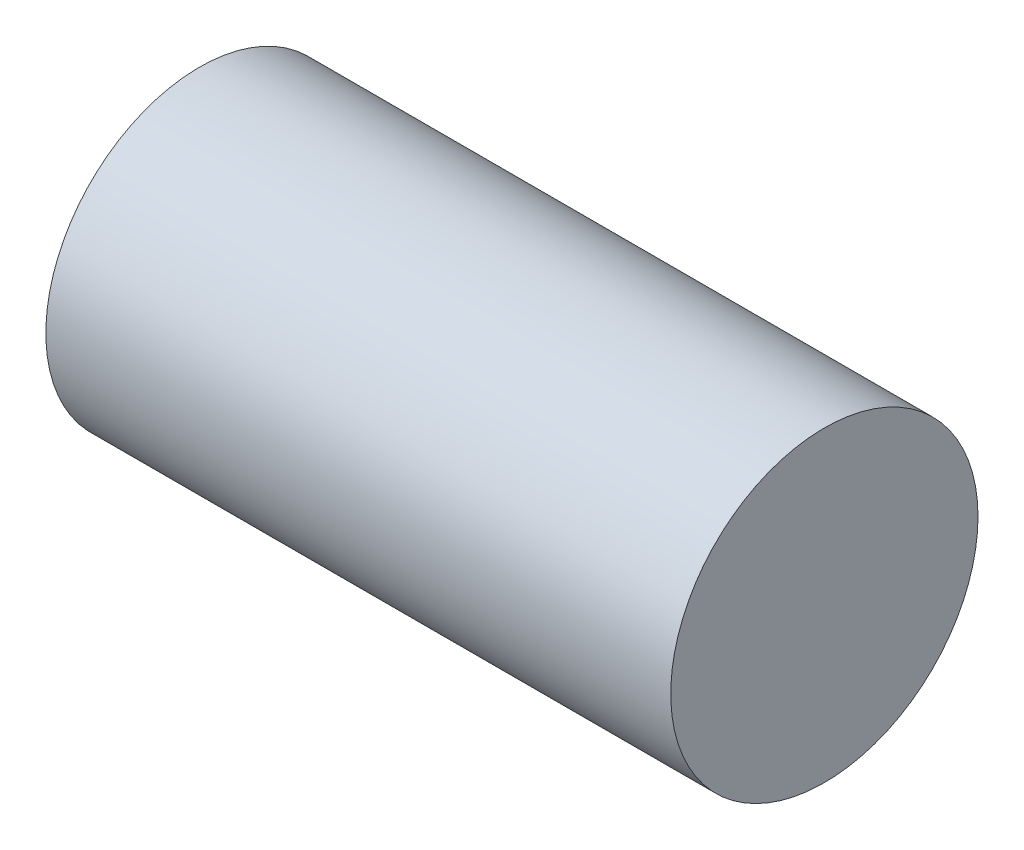
ISO-10303-21;
HEADER;
FILE_DESCRIPTION(('STEP AP214'),'2;1');
FILE_NAME('part.step','',(''),(''),'','','');
FILE_SCHEMA(('AUTOMOTIVE_DESIGN { 1 0 10303 214 1 1 1 1 }'));
ENDSEC;
DATA;
#1=APPLICATION_CONTEXT('core data for automotive mechanical design processes');
#2=APPLICATION_PROTOCOL_DEFINITION('international standard','automotive_design',2000,#1);
#3=PRODUCT_CONTEXT('',#1,'mechanical');
#4=PRODUCT('Part','Part','',(#3));
#5=PRODUCT_RELATED_PRODUCT_CATEGORY('part','',(#4));
#6=PRODUCT_DEFINITION_FORMATION('','',#4);
#7=PRODUCT_DEFINITION_CONTEXT('part definition',#1,'design');
#8=PRODUCT_DEFINITION('design','',#6,#7);
#9=PRODUCT_DEFINITION_SHAPE('','',#8);
#10=(LENGTH_UNIT() NAMED_UNIT(*) SI_UNIT(.MILLI.,.METRE.));
#11=(NAMED_UNIT(*) PLANE_ANGLE_UNIT() SI_UNIT($,.RADIAN.));
#12=(NAMED_UNIT(*) SI_UNIT($,.STERADIAN.) SOLID_ANGLE_UNIT());
#13=UNCERTAINTY_MEASURE_WITH_UNIT(LENGTH_MEASURE(1.E-05),#10,'distance_accuracy_value','');
#14=(GEOMETRIC_REPRESENTATION_CONTEXT(3) GLOBAL_UNCERTAINTY_ASSIGNED_CONTEXT((#13)) GLOBAL_UNIT_ASSIGNED_CONTEXT((#10,
#11,#12)) REPRESENTATION_CONTEXT('',''));
#15=CARTESIAN_POINT('',(0.,0.,0.));
#16=DIRECTION('',(0.,0.,1.));
#17=DIRECTION('',(1.,0.,0.));
#18=AXIS2_PLACEMENT_3D('',#15,#16,#17);
#19=CARTESIAN_POINT('',(12.,0.,0.));
#20=DIRECTION('',(-1.,0.,0.));
#21=DIRECTION('',(0.,0.,1.));
#22=AXIS2_PLACEMENT_3D('',#19,#20,#21);
#23=CYLINDRICAL_SURFACE('',#22,2.95);
#24=CARTESIAN_POINT('',(12.,0.,0.));
#25=DIRECTION('',(1.,0.,0.));
#26=DIRECTION('',(0.,0.,-1.));
#27=AXIS2_PLACEMENT_3D('',#24,#25,#26);
#28=CIRCLE('',#27,2.95);
#29=CARTESIAN_POINT('',(12.,0.,-2.95));
#30=VERTEX_POINT('',#29);
#31=EDGE_CURVE('E10',#30,#30,#28,.T.);
#32=ORIENTED_EDGE('',*,*,#31,.F.);
#33=EDGE_LOOP('',(#32));
#34=FACE_BOUND('',#33,.T.);
#35=CARTESIAN_POINT('',(0.,0.,0.));
#36=DIRECTION('',(1.,0.,0.));
#37=DIRECTION('',(0.,0.,-1.));
#38=AXIS2_PLACEMENT_3D('',#35,#36,#37);
#39=CIRCLE('',#38,2.95);
#40=CARTESIAN_POINT('',(0.,0.,-2.95));
#41=VERTEX_POINT('',#40);
#42=EDGE_CURVE('E44',#41,#41,#39,.T.);
#43=ORIENTED_EDGE('',*,*,#42,.T.);
#44=EDGE_LOOP('',(#43));
#45=FACE_BOUND('',#44,.T.);
#46=ADVANCED_FACE('F41',(#34,#45),#23,.T.);
#47=CARTESIAN_POINT('',(12.,0.,0.));
#48=DIRECTION('',(1.,0.,0.));
#49=DIRECTION('',(0.,0.,-1.));
#50=AXIS2_PLACEMENT_3D('',#47,#48,#49);
#51=PLANE('',#50);
#52=ORIENTED_EDGE('',*,*,#31,.T.);
#53=EDGE_LOOP('',(#52));
#54=FACE_BOUND('',#53,.T.);
#55=ADVANCED_FACE('F56',(#54),#51,.T.);
#56=CARTESIAN_POINT('',(0.,0.,0.));
#57=DIRECTION('',(1.,0.,0.));
#58=DIRECTION('',(0.,0.,-1.));
#59=AXIS2_PLACEMENT_3D('',#56,#57,#58);
#60=PLANE('',#59);
#61=ORIENTED_EDGE('',*,*,#42,.F.);
#62=EDGE_LOOP('',(#61));
#63=FACE_BOUND('',#62,.T.);
#64=ADVANCED_FACE('F54',(#63),#60,.F.);
#65=CLOSED_SHELL('',(#46,#55,#64));
#66=MANIFOLD_SOLID_BREP('B2',#65);
#67=ADVANCED_BREP_SHAPE_REPRESENTATION('',(#18,#66),#14);
#68=SHAPE_DEFINITION_REPRESENTATION(#9,#67);
ENDSEC;
END-ISO-10303-21;
